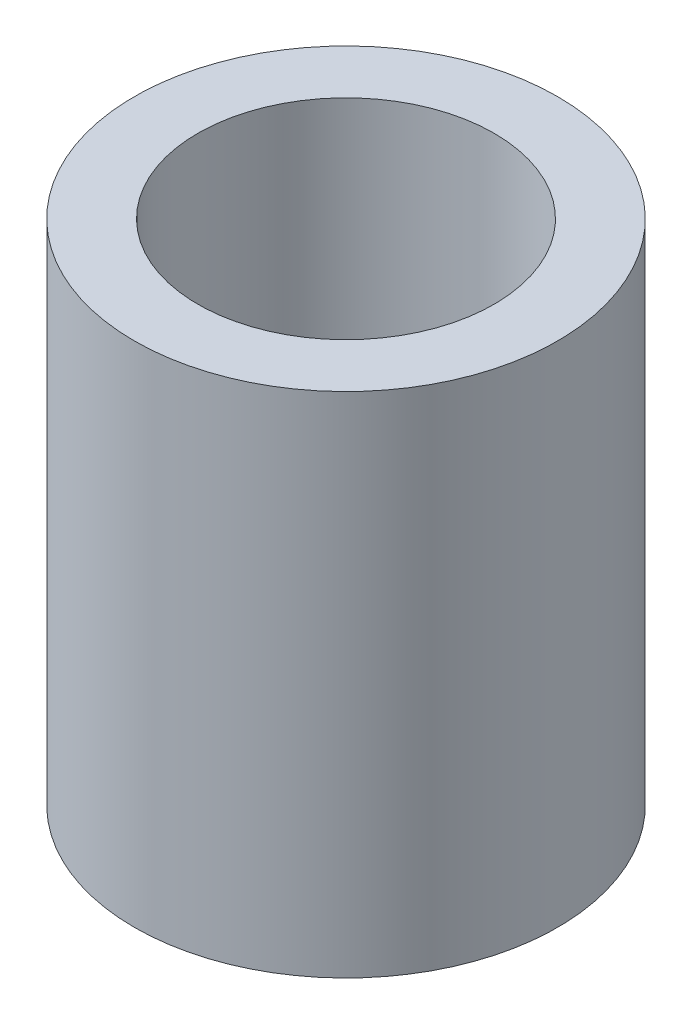
ISO-10303-21;
HEADER;
FILE_DESCRIPTION(('STEP AP214'),'2;1');
FILE_NAME('part.step','',(''),(''),'','','');
FILE_SCHEMA(('AUTOMOTIVE_DESIGN { 1 0 10303 214 1 1 1 1 }'));
ENDSEC;
DATA;
#1=APPLICATION_CONTEXT('core data for automotive mechanical design processes');
#2=APPLICATION_PROTOCOL_DEFINITION('international standard','automotive_design',2000,#1);
#3=PRODUCT_CONTEXT('',#1,'mechanical');
#4=PRODUCT('Part','Part','',(#3));
#5=PRODUCT_RELATED_PRODUCT_CATEGORY('part','',(#4));
#6=PRODUCT_DEFINITION_FORMATION('','',#4);
#7=PRODUCT_DEFINITION_CONTEXT('part definition',#1,'design');
#8=PRODUCT_DEFINITION('design','',#6,#7);
#9=PRODUCT_DEFINITION_SHAPE('','',#8);
#10=(LENGTH_UNIT() NAMED_UNIT(*) SI_UNIT(.MILLI.,.METRE.));
#11=(NAMED_UNIT(*) PLANE_ANGLE_UNIT() SI_UNIT($,.RADIAN.));
#12=(NAMED_UNIT(*) SI_UNIT($,.STERADIAN.) SOLID_ANGLE_UNIT());
#13=UNCERTAINTY_MEASURE_WITH_UNIT(LENGTH_MEASURE(1.E-05),#10,'distance_accuracy_value','');
#14=(GEOMETRIC_REPRESENTATION_CONTEXT(3) GLOBAL_UNCERTAINTY_ASSIGNED_CONTEXT((#13)) GLOBAL_UNIT_ASSIGNED_CONTEXT((#10,
#11,#12)) REPRESENTATION_CONTEXT('',''));
#15=CARTESIAN_POINT('',(0.,0.,0.));
#16=DIRECTION('',(0.,0.,1.));
#17=DIRECTION('',(1.,0.,0.));
#18=AXIS2_PLACEMENT_3D('',#15,#16,#17);
#19=CARTESIAN_POINT('',(0.,19.05,0.));
#20=DIRECTION('',(0.,1.,0.));
#21=DIRECTION('',(0.,0.,1.));
#22=AXIS2_PLACEMENT_3D('',#19,#20,#21);
#23=PLANE('',#22);
#24=CARTESIAN_POINT('',(0.,19.05,0.));
#25=DIRECTION('',(0.,1.,0.));
#26=DIRECTION('',(0.,0.,1.));
#27=AXIS2_PLACEMENT_3D('',#24,#25,#26);
#28=CIRCLE('',#27,7.9375);
#29=CARTESIAN_POINT('',(0.,19.05,-7.9375));
#30=VERTEX_POINT('',#29);
#31=EDGE_CURVE('E10',#30,#30,#28,.T.);
#32=ORIENTED_EDGE('',*,*,#31,.T.);
#33=EDGE_LOOP('',(#32));
#34=FACE_BOUND('',#33,.T.);
#35=CARTESIAN_POINT('',(0.,19.05,0.));
#36=DIRECTION('',(0.,1.,0.));
#37=DIRECTION('',(0.,0.,1.));
#38=AXIS2_PLACEMENT_3D('',#35,#36,#37);
#39=CIRCLE('',#38,5.55625);
#40=CARTESIAN_POINT('',(0.,19.05,-5.55625));
#41=VERTEX_POINT('',#40);
#42=EDGE_CURVE('E48',#41,#41,#39,.T.);
#43=ORIENTED_EDGE('',*,*,#42,.F.);
#44=EDGE_LOOP('',(#43));
#45=FACE_BOUND('',#44,.T.);
#46=ADVANCED_FACE('F37',(#34,#45),#23,.T.);
#47=CARTESIAN_POINT('',(0.,0.,0.));
#48=DIRECTION('',(0.,1.,0.));
#49=DIRECTION('',(0.,0.,1.));
#50=AXIS2_PLACEMENT_3D('',#47,#48,#49);
#51=PLANE('',#50);
#52=CARTESIAN_POINT('',(0.,0.,0.));
#53=DIRECTION('',(0.,1.,0.));
#54=DIRECTION('',(0.,0.,1.));
#55=AXIS2_PLACEMENT_3D('',#52,#53,#54);
#56=CIRCLE('',#55,7.9375);
#57=CARTESIAN_POINT('',(0.,0.,-7.9375));
#58=VERTEX_POINT('',#57);
#59=EDGE_CURVE('E41',#58,#58,#56,.T.);
#60=ORIENTED_EDGE('',*,*,#59,.F.);
#61=EDGE_LOOP('',(#60));
#62=FACE_BOUND('',#61,.T.);
#63=CARTESIAN_POINT('',(0.,0.,0.));
#64=DIRECTION('',(0.,1.,0.));
#65=DIRECTION('',(0.,0.,1.));
#66=AXIS2_PLACEMENT_3D('',#63,#64,#65);
#67=CIRCLE('',#66,5.55625);
#68=CARTESIAN_POINT('',(0.,0.,-5.55625));
#69=VERTEX_POINT('',#68);
#70=EDGE_CURVE('E50',#69,#69,#67,.T.);
#71=ORIENTED_EDGE('',*,*,#70,.T.);
#72=EDGE_LOOP('',(#71));
#73=FACE_BOUND('',#72,.T.);
#74=ADVANCED_FACE('F60',(#62,#73),#51,.F.);
#75=CARTESIAN_POINT('',(0.,19.05,0.));
#76=DIRECTION('',(0.,-1.,0.));
#77=DIRECTION('',(0.,0.,-1.));
#78=AXIS2_PLACEMENT_3D('',#75,#76,#77);
#79=CYLINDRICAL_SURFACE('',#78,7.9375);
#80=CARTESIAN_POINT('',(0.,19.05,-7.9375));
#81=CARTESIAN_POINT('',(0.,18.8515625,-7.9375));
#82=CARTESIAN_POINT('',(0.,18.653125,-7.9375));
#83=CARTESIAN_POINT('',(0.,18.25625,-7.9375));
#84=CARTESIAN_POINT('',(0.,18.0578125,-7.9375));
#85=CARTESIAN_POINT('',(0.,17.6609375,-7.9375));
#86=CARTESIAN_POINT('',(0.,17.4625,-7.9375));
#87=CARTESIAN_POINT('',(0.,17.065625,-7.9375));
#88=CARTESIAN_POINT('',(0.,16.8671875,-7.9375));
#89=CARTESIAN_POINT('',(0.,16.4703125,-7.9375));
#90=CARTESIAN_POINT('',(0.,16.271875,-7.9375));
#91=CARTESIAN_POINT('',(0.,15.875,-7.9375));
#92=CARTESIAN_POINT('',(0.,15.6765625,-7.9375));
#93=CARTESIAN_POINT('',(0.,15.2796875,-7.9375));
#94=CARTESIAN_POINT('',(0.,15.08125,-7.9375));
#95=CARTESIAN_POINT('',(0.,14.684375,-7.9375));
#96=CARTESIAN_POINT('',(0.,14.4859375,-7.9375));
#97=CARTESIAN_POINT('',(0.,14.0890625,-7.9375));
#98=CARTESIAN_POINT('',(0.,13.890625,-7.9375));
#99=CARTESIAN_POINT('',(0.,13.49375,-7.9375));
#100=CARTESIAN_POINT('',(0.,13.2953125,-7.9375));
#101=CARTESIAN_POINT('',(0.,12.8984375,-7.9375));
#102=CARTESIAN_POINT('',(0.,12.7,-7.9375));
#103=CARTESIAN_POINT('',(0.,12.303125,-7.9375));
#104=CARTESIAN_POINT('',(0.,12.1046875,-7.9375));
#105=CARTESIAN_POINT('',(0.,11.7078125,-7.9375));
#106=CARTESIAN_POINT('',(0.,11.509375,-7.9375));
#107=CARTESIAN_POINT('',(0.,11.1125,-7.9375));
#108=CARTESIAN_POINT('',(0.,10.9140625,-7.9375));
#109=CARTESIAN_POINT('',(0.,10.5171875,-7.9375));
#110=CARTESIAN_POINT('',(0.,10.31875,-7.9375));
#111=CARTESIAN_POINT('',(0.,9.921875,-7.9375));
#112=CARTESIAN_POINT('',(0.,9.7234375,-7.9375));
#113=CARTESIAN_POINT('',(0.,9.3265625,-7.9375));
#114=CARTESIAN_POINT('',(0.,9.128125,-7.9375));
#115=CARTESIAN_POINT('',(0.,8.73125,-7.9375));
#116=CARTESIAN_POINT('',(0.,8.5328125,-7.9375));
#117=CARTESIAN_POINT('',(0.,8.1359375,-7.9375));
#118=CARTESIAN_POINT('',(0.,7.9375,-7.9375));
#119=CARTESIAN_POINT('',(0.,7.540625,-7.9375));
#120=CARTESIAN_POINT('',(0.,7.3421875,-7.9375));
#121=CARTESIAN_POINT('',(0.,6.9453125,-7.9375));
#122=CARTESIAN_POINT('',(0.,6.746875,-7.9375));
#123=CARTESIAN_POINT('',(0.,6.35,-7.9375));
#124=CARTESIAN_POINT('',(0.,6.1515625,-7.9375));
#125=CARTESIAN_POINT('',(0.,5.7546875,-7.9375));
#126=CARTESIAN_POINT('',(0.,5.55625,-7.9375));
#127=CARTESIAN_POINT('',(0.,5.159375,-7.9375));
#128=CARTESIAN_POINT('',(0.,4.9609375,-7.9375));
#129=CARTESIAN_POINT('',(0.,4.5640625,-7.9375));
#130=CARTESIAN_POINT('',(0.,4.365625,-7.9375));
#131=CARTESIAN_POINT('',(0.,3.96875,-7.9375));
#132=CARTESIAN_POINT('',(0.,3.7703125,-7.9375));
#133=CARTESIAN_POINT('',(0.,3.3734375,-7.9375));
#134=CARTESIAN_POINT('',(0.,3.175,-7.9375));
#135=CARTESIAN_POINT('',(0.,2.778125,-7.9375));
#136=CARTESIAN_POINT('',(0.,2.5796875,-7.9375));
#137=CARTESIAN_POINT('',(0.,2.1828125,-7.9375));
#138=CARTESIAN_POINT('',(0.,1.984375,-7.9375));
#139=CARTESIAN_POINT('',(0.,1.5875,-7.9375));
#140=CARTESIAN_POINT('',(0.,1.3890625,-7.9375));
#141=CARTESIAN_POINT('',(0.,0.992187500000001,-7.9375));
#142=CARTESIAN_POINT('',(0.,0.793750000000001,-7.9375));
#143=CARTESIAN_POINT('',(0.,0.396875,-7.9375));
#144=CARTESIAN_POINT('',(0.,0.1984375,-7.9375));
#145=CARTESIAN_POINT('',(0.,0.,-7.9375));
#146=B_SPLINE_CURVE_WITH_KNOTS('',3,(#80,#81,#82,#83,#84,#85,#86,#87,#88,#89,#90,#91,#92,#93,
#94,#95,#96,#97,#98,#99,#100,#101,#102,#103,#104,#105,#106,#107,#108,#109,#110,#111,#112,#113,
#114,#115,#116,#117,#118,#119,#120,#121,#122,#123,#124,#125,#126,#127,#128,#129,#130,#131,#132,
#133,#134,#135,#136,#137,#138,#139,#140,#141,#142,#143,#144,#145),.UNSPECIFIED.,.F.,.F.,(4,2,2,
2,2,2,2,2,2,2,2,2,2,2,2,2,2,2,2,2,2,2,2,2,2,2,2,2,2,2,2,2,4),(0.,0.595312499999997,1.190625,
1.7859375,2.38125,2.9765625,3.571875,4.1671875,4.7625,5.3578125,5.953125,6.5484375,7.14375,
7.7390625,8.334375,8.9296875,9.525,10.1203125,10.715625,11.3109375,11.90625,12.5015625,
13.096875,13.6921875,14.2875,14.8828125,15.478125,16.0734375,16.66875,17.2640625,17.859375,
18.4546875,19.05),.UNSPECIFIED.);
#147=EDGE_CURVE('BSEAM39',#30,#58,#146,.T.);
#148=ORIENTED_EDGE('',*,*,#31,.F.);
#149=ORIENTED_EDGE('',*,*,#59,.T.);
#150=ORIENTED_EDGE('',*,*,#147,.T.);
#151=ORIENTED_EDGE('',*,*,#147,.F.);
#152=EDGE_LOOP('',(#148,#150,#149,#151));
#153=FACE_BOUND('',#152,.T.);
#154=ADVANCED_FACE('F39',(#153),#79,.T.);
#155=CARTESIAN_POINT('',(0.,19.05,0.));
#156=DIRECTION('',(0.,-1.,0.));
#157=DIRECTION('',(0.,0.,-1.));
#158=AXIS2_PLACEMENT_3D('',#155,#156,#157);
#159=CYLINDRICAL_SURFACE('',#158,5.55625);
#160=CARTESIAN_POINT('',(0.,19.05,-5.55625));
#161=CARTESIAN_POINT('',(0.,18.8515625,-5.55625));
#162=CARTESIAN_POINT('',(0.,18.653125,-5.55625));
#163=CARTESIAN_POINT('',(0.,18.25625,-5.55625));
#164=CARTESIAN_POINT('',(0.,18.0578125,-5.55625));
#165=CARTESIAN_POINT('',(0.,17.6609375,-5.55625));
#166=CARTESIAN_POINT('',(0.,17.4625,-5.55625));
#167=CARTESIAN_POINT('',(0.,17.065625,-5.55625));
#168=CARTESIAN_POINT('',(0.,16.8671875,-5.55625));
#169=CARTESIAN_POINT('',(0.,16.4703125,-5.55625));
#170=CARTESIAN_POINT('',(0.,16.271875,-5.55625));
#171=CARTESIAN_POINT('',(0.,15.875,-5.55625));
#172=CARTESIAN_POINT('',(0.,15.6765625,-5.55625));
#173=CARTESIAN_POINT('',(0.,15.2796875,-5.55625));
#174=CARTESIAN_POINT('',(0.,15.08125,-5.55625));
#175=CARTESIAN_POINT('',(0.,14.684375,-5.55625));
#176=CARTESIAN_POINT('',(0.,14.4859375,-5.55625));
#177=CARTESIAN_POINT('',(0.,14.0890625,-5.55625));
#178=CARTESIAN_POINT('',(0.,13.890625,-5.55625));
#179=CARTESIAN_POINT('',(0.,13.49375,-5.55625));
#180=CARTESIAN_POINT('',(0.,13.2953125,-5.55625));
#181=CARTESIAN_POINT('',(0.,12.8984375,-5.55625));
#182=CARTESIAN_POINT('',(0.,12.7,-5.55625));
#183=CARTESIAN_POINT('',(0.,12.303125,-5.55625));
#184=CARTESIAN_POINT('',(0.,12.1046875,-5.55625));
#185=CARTESIAN_POINT('',(0.,11.7078125,-5.55625));
#186=CARTESIAN_POINT('',(0.,11.509375,-5.55625));
#187=CARTESIAN_POINT('',(0.,11.1125,-5.55625));
#188=CARTESIAN_POINT('',(0.,10.9140625,-5.55625));
#189=CARTESIAN_POINT('',(0.,10.5171875,-5.55625));
#190=CARTESIAN_POINT('',(0.,10.31875,-5.55625));
#191=CARTESIAN_POINT('',(0.,9.921875,-5.55625));
#192=CARTESIAN_POINT('',(0.,9.7234375,-5.55625));
#193=CARTESIAN_POINT('',(0.,9.3265625,-5.55625));
#194=CARTESIAN_POINT('',(0.,9.128125,-5.55625));
#195=CARTESIAN_POINT('',(0.,8.73125,-5.55625));
#196=CARTESIAN_POINT('',(0.,8.5328125,-5.55625));
#197=CARTESIAN_POINT('',(0.,8.1359375,-5.55625));
#198=CARTESIAN_POINT('',(0.,7.9375,-5.55625));
#199=CARTESIAN_POINT('',(0.,7.540625,-5.55625));
#200=CARTESIAN_POINT('',(0.,7.3421875,-5.55625));
#201=CARTESIAN_POINT('',(0.,6.9453125,-5.55625));
#202=CARTESIAN_POINT('',(0.,6.746875,-5.55625));
#203=CARTESIAN_POINT('',(0.,6.35,-5.55625));
#204=CARTESIAN_POINT('',(0.,6.1515625,-5.55625));
#205=CARTESIAN_POINT('',(0.,5.7546875,-5.55625));
#206=CARTESIAN_POINT('',(0.,5.55625,-5.55625));
#207=CARTESIAN_POINT('',(0.,5.159375,-5.55625));
#208=CARTESIAN_POINT('',(0.,4.9609375,-5.55625));
#209=CARTESIAN_POINT('',(0.,4.5640625,-5.55625));
#210=CARTESIAN_POINT('',(0.,4.365625,-5.55625));
#211=CARTESIAN_POINT('',(0.,3.96875,-5.55625));
#212=CARTESIAN_POINT('',(0.,3.7703125,-5.55625));
#213=CARTESIAN_POINT('',(0.,3.3734375,-5.55625));
#214=CARTESIAN_POINT('',(0.,3.175,-5.55625));
#215=CARTESIAN_POINT('',(0.,2.778125,-5.55625));
#216=CARTESIAN_POINT('',(0.,2.5796875,-5.55625));
#217=CARTESIAN_POINT('',(0.,2.1828125,-5.55625));
#218=CARTESIAN_POINT('',(0.,1.984375,-5.55625));
#219=CARTESIAN_POINT('',(0.,1.5875,-5.55625));
#220=CARTESIAN_POINT('',(0.,1.3890625,-5.55625));
#221=CARTESIAN_POINT('',(0.,0.992187500000001,-5.55625));
#222=CARTESIAN_POINT('',(0.,0.793750000000001,-5.55625));
#223=CARTESIAN_POINT('',(0.,0.396875,-5.55625));
#224=CARTESIAN_POINT('',(0.,0.1984375,-5.55625));
#225=CARTESIAN_POINT('',(0.,0.,-5.55625));
#226=B_SPLINE_CURVE_WITH_KNOTS('',3,(#160,#161,#162,#163,#164,#165,#166,#167,#168,#169,#170,
#171,#172,#173,#174,#175,#176,#177,#178,#179,#180,#181,#182,#183,#184,#185,#186,#187,#188,#189,
#190,#191,#192,#193,#194,#195,#196,#197,#198,#199,#200,#201,#202,#203,#204,#205,#206,#207,#208,
#209,#210,#211,#212,#213,#214,#215,#216,#217,#218,#219,#220,#221,#222,#223,#224,#225),
.UNSPECIFIED.,.F.,.F.,(4,2,2,2,2,2,2,2,2,2,2,2,2,2,2,2,2,2,2,2,2,2,2,2,2,2,2,2,2,2,2,2,4),(0.,
0.595312499999997,1.190625,1.7859375,2.38125,2.9765625,3.571875,4.1671875,4.7625,5.3578125,
5.953125,6.5484375,7.14375,7.7390625,8.334375,8.9296875,9.525,10.1203125,10.715625,11.3109375,
11.90625,12.5015625,13.096875,13.6921875,14.2875,14.8828125,15.478125,16.0734375,16.66875,
17.2640625,17.859375,18.4546875,19.05),.UNSPECIFIED.);
#227=EDGE_CURVE('BSEAM56',#41,#69,#226,.T.);
#228=ORIENTED_EDGE('',*,*,#42,.T.);
#229=ORIENTED_EDGE('',*,*,#70,.F.);
#230=ORIENTED_EDGE('',*,*,#227,.T.);
#231=ORIENTED_EDGE('',*,*,#227,.F.);
#232=EDGE_LOOP('',(#228,#230,#229,#231));
#233=FACE_BOUND('',#232,.T.);
#234=ADVANCED_FACE('F56',(#233),#159,.F.);
#235=CLOSED_SHELL('',(#46,#74,#154,#234));
#236=MANIFOLD_SOLID_BREP('B2',#235);
#237=ADVANCED_BREP_SHAPE_REPRESENTATION('',(#18,#236),#14);
#238=SHAPE_DEFINITION_REPRESENTATION(#9,#237);
ENDSEC;
END-ISO-10303-21;
